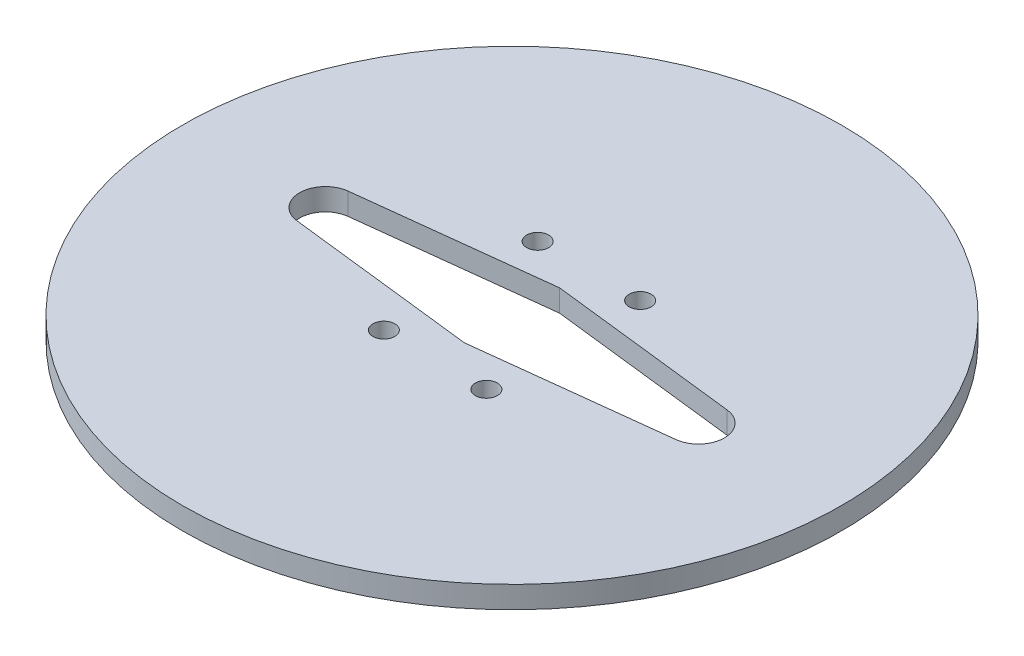
ISO-10303-21;
HEADER;
FILE_DESCRIPTION(('STEP AP214'),'2;1');
FILE_NAME('part.step','',(''),(''),'','','');
FILE_SCHEMA(('AUTOMOTIVE_DESIGN { 1 0 10303 214 1 1 1 1 }'));
ENDSEC;
DATA;
#1=APPLICATION_CONTEXT('core data for automotive mechanical design processes');
#2=APPLICATION_PROTOCOL_DEFINITION('international standard','automotive_design',2000,#1);
#3=PRODUCT_CONTEXT('',#1,'mechanical');
#4=PRODUCT('Part','Part','',(#3));
#5=PRODUCT_RELATED_PRODUCT_CATEGORY('part','',(#4));
#6=PRODUCT_DEFINITION_FORMATION('','',#4);
#7=PRODUCT_DEFINITION_CONTEXT('part definition',#1,'design');
#8=PRODUCT_DEFINITION('design','',#6,#7);
#9=PRODUCT_DEFINITION_SHAPE('','',#8);
#10=(LENGTH_UNIT() NAMED_UNIT(*) SI_UNIT(.MILLI.,.METRE.));
#11=(NAMED_UNIT(*) PLANE_ANGLE_UNIT() SI_UNIT($,.RADIAN.));
#12=(NAMED_UNIT(*) SI_UNIT($,.STERADIAN.) SOLID_ANGLE_UNIT());
#13=UNCERTAINTY_MEASURE_WITH_UNIT(LENGTH_MEASURE(1.E-05),#10,'distance_accuracy_value','');
#14=(GEOMETRIC_REPRESENTATION_CONTEXT(3) GLOBAL_UNCERTAINTY_ASSIGNED_CONTEXT((#13)) GLOBAL_UNIT_ASSIGNED_CONTEXT((#10,
#11,#12)) REPRESENTATION_CONTEXT('',''));
#15=CARTESIAN_POINT('',(0.,0.,0.));
#16=DIRECTION('',(0.,0.,1.));
#17=DIRECTION('',(1.,0.,0.));
#18=AXIS2_PLACEMENT_3D('',#15,#16,#17);
#19=CARTESIAN_POINT('',(0.,3.,0.));
#20=DIRECTION('',(0.,-1.,0.));
#21=DIRECTION('',(0.,0.,-1.));
#22=AXIS2_PLACEMENT_3D('',#19,#20,#21);
#23=CYLINDRICAL_SURFACE('',#22,45.);
#24=CARTESIAN_POINT('',(0.,3.,0.));
#25=DIRECTION('',(0.,1.,0.));
#26=DIRECTION('',(0.,0.,1.));
#27=AXIS2_PLACEMENT_3D('',#24,#25,#26);
#28=CIRCLE('',#27,45.);
#29=CARTESIAN_POINT('',(0.,3.,45.));
#30=VERTEX_POINT('',#29);
#31=EDGE_CURVE('E11',#30,#30,#28,.T.);
#32=ORIENTED_EDGE('',*,*,#31,.F.);
#33=EDGE_LOOP('',(#32));
#34=FACE_BOUND('',#33,.T.);
#35=CARTESIAN_POINT('',(0.,0.,0.));
#36=DIRECTION('',(0.,1.,0.));
#37=DIRECTION('',(0.,0.,1.));
#38=AXIS2_PLACEMENT_3D('',#35,#36,#37);
#39=CIRCLE('',#38,45.);
#40=CARTESIAN_POINT('',(0.,0.,45.));
#41=VERTEX_POINT('',#40);
#42=EDGE_CURVE('E47',#41,#41,#39,.T.);
#43=ORIENTED_EDGE('',*,*,#42,.T.);
#44=EDGE_LOOP('',(#43));
#45=FACE_BOUND('',#44,.T.);
#46=ADVANCED_FACE('F44',(#34,#45),#23,.T.);
#47=CARTESIAN_POINT('',(0.,3.,0.));
#48=DIRECTION('',(0.,1.,0.));
#49=DIRECTION('',(0.,0.,1.));
#50=AXIS2_PLACEMENT_3D('',#47,#48,#49);
#51=PLANE('',#50);
#52=CARTESIAN_POINT('',(7.,3.,10.5));
#53=DIRECTION('',(0.,1.,0.));
#54=DIRECTION('',(0.,0.,1.));
#55=AXIS2_PLACEMENT_3D('',#52,#53,#54);
#56=CIRCLE('',#55,1.5);
#57=CARTESIAN_POINT('',(7.,3.,12.));
#58=VERTEX_POINT('',#57);
#59=EDGE_CURVE('E310',#58,#58,#56,.T.);
#60=ORIENTED_EDGE('',*,*,#59,.F.);
#61=EDGE_LOOP('',(#60));
#62=FACE_BOUND('',#61,.T.);
#63=CARTESIAN_POINT('',(-7.,3.,-10.5));
#64=DIRECTION('',(0.,1.,0.));
#65=DIRECTION('',(0.,0.,1.));
#66=AXIS2_PLACEMENT_3D('',#63,#64,#65);
#67=CIRCLE('',#66,1.5);
#68=CARTESIAN_POINT('',(-7.,3.,-9.));
#69=VERTEX_POINT('',#68);
#70=EDGE_CURVE('E316',#69,#69,#67,.T.);
#71=ORIENTED_EDGE('',*,*,#70,.F.);
#72=EDGE_LOOP('',(#71));
#73=FACE_BOUND('',#72,.T.);
#74=CARTESIAN_POINT('',(7.,3.,-10.5));
#75=DIRECTION('',(0.,1.,0.));
#76=DIRECTION('',(0.,0.,1.));
#77=AXIS2_PLACEMENT_3D('',#74,#75,#76);
#78=CIRCLE('',#77,1.5);
#79=CARTESIAN_POINT('',(7.,3.,-9.));
#80=VERTEX_POINT('',#79);
#81=EDGE_CURVE('E328',#80,#80,#78,.T.);
#82=ORIENTED_EDGE('',*,*,#81,.F.);
#83=EDGE_LOOP('',(#82));
#84=FACE_BOUND('',#83,.T.);
#85=CARTESIAN_POINT('',(-7.,3.,10.5));
#86=DIRECTION('',(0.,1.,0.));
#87=DIRECTION('',(0.,0.,1.));
#88=AXIS2_PLACEMENT_3D('',#85,#86,#87);
#89=CIRCLE('',#88,1.5);
#90=CARTESIAN_POINT('',(-7.,3.,12.));
#91=VERTEX_POINT('',#90);
#92=EDGE_CURVE('E126',#91,#91,#89,.T.);
#93=ORIENTED_EDGE('',*,*,#92,.F.);
#94=EDGE_LOOP('',(#93));
#95=FACE_BOUND('',#94,.T.);
#96=CARTESIAN_POINT('',(-25.4765671512781,3.,0.));
#97=DIRECTION('',(0.,1.,0.));
#98=DIRECTION('',(0.,0.,1.));
#99=AXIS2_PLACEMENT_3D('',#96,#97,#98);
#100=CIRCLE('',#99,3.52343284872192);
#101=CARTESIAN_POINT('',(-25.8822505739769,3.,-3.49999999999999));
#102=VERTEX_POINT('',#101);
#103=CARTESIAN_POINT('',(-25.8822505739769,3.,3.5));
#104=VERTEX_POINT('',#103);
#105=EDGE_CURVE('E59',#102,#104,#100,.T.);
#106=ORIENTED_EDGE('',*,*,#105,.F.);
#107=DIRECTION('',(-0.993349426616597,0.,0.115138684378787));
#108=VECTOR('',#107,1.);
#109=CARTESIAN_POINT('',(-25.8822505739769,3.,-3.49999999999999));
#110=LINE('',#109,#108);
#111=CARTESIAN_POINT('',(0.,3.,-6.5));
#112=VERTEX_POINT('',#111);
#113=EDGE_CURVE('E119',#112,#102,#110,.T.);
#114=ORIENTED_EDGE('',*,*,#113,.F.);
#115=DIRECTION('',(-0.993349426616597,0.,-0.115138684378786));
#116=VECTOR('',#115,1.);
#117=CARTESIAN_POINT('',(0.,3.,-6.5));
#118=LINE('',#117,#116);
#119=CARTESIAN_POINT('',(25.8822505739769,3.,-3.50000000000001));
#120=VERTEX_POINT('',#119);
#121=EDGE_CURVE('E123',#120,#112,#118,.T.);
#122=ORIENTED_EDGE('',*,*,#121,.F.);
#123=CARTESIAN_POINT('',(25.4765671512781,3.,0.));
#124=DIRECTION('',(0.,1.,0.));
#125=DIRECTION('',(0.,0.,1.));
#126=AXIS2_PLACEMENT_3D('',#123,#124,#125);
#127=CIRCLE('',#126,3.52343284872192);
#128=CARTESIAN_POINT('',(25.8822505739769,3.,3.49999999999999));
#129=VERTEX_POINT('',#128);
#130=EDGE_CURVE('E150',#129,#120,#127,.T.);
#131=ORIENTED_EDGE('',*,*,#130,.F.);
#132=DIRECTION('',(0.993349426616597,0.,-0.115138684378787));
#133=VECTOR('',#132,1.);
#134=CARTESIAN_POINT('',(25.8822505739769,3.,3.49999999999999));
#135=LINE('',#134,#133);
#136=CARTESIAN_POINT('',(0.,3.,6.5));
#137=VERTEX_POINT('',#136);
#138=EDGE_CURVE('E146',#137,#129,#135,.T.);
#139=ORIENTED_EDGE('',*,*,#138,.F.);
#140=DIRECTION('',(0.993349426616597,0.,0.115138684378786));
#141=VECTOR('',#140,1.);
#142=CARTESIAN_POINT('',(0.,3.,6.5));
#143=LINE('',#142,#141);
#144=EDGE_CURVE('E142',#104,#137,#143,.T.);
#145=ORIENTED_EDGE('',*,*,#144,.F.);
#146=EDGE_LOOP('',(#106,#114,#122,#131,#139,#145));
#147=FACE_BOUND('',#146,.T.);
#148=ORIENTED_EDGE('',*,*,#31,.T.);
#149=EDGE_LOOP('',(#148));
#150=FACE_BOUND('',#149,.T.);
#151=ADVANCED_FACE('F174',(#62,#73,#84,#95,#147,#150),#51,.T.);
#152=CARTESIAN_POINT('',(0.,0.,0.));
#153=DIRECTION('',(0.,1.,0.));
#154=DIRECTION('',(0.,0.,1.));
#155=AXIS2_PLACEMENT_3D('',#152,#153,#154);
#156=PLANE('',#155);
#157=CARTESIAN_POINT('',(7.,0.,10.5));
#158=DIRECTION('',(0.,1.,0.));
#159=DIRECTION('',(0.,0.,1.));
#160=AXIS2_PLACEMENT_3D('',#157,#158,#159);
#161=CIRCLE('',#160,1.5);
#162=CARTESIAN_POINT('',(7.,0.,12.));
#163=VERTEX_POINT('',#162);
#164=EDGE_CURVE('E307',#163,#163,#161,.T.);
#165=ORIENTED_EDGE('',*,*,#164,.T.);
#166=EDGE_LOOP('',(#165));
#167=FACE_BOUND('',#166,.T.);
#168=CARTESIAN_POINT('',(-7.,0.,-10.5));
#169=DIRECTION('',(0.,1.,0.));
#170=DIRECTION('',(0.,0.,1.));
#171=AXIS2_PLACEMENT_3D('',#168,#169,#170);
#172=CIRCLE('',#171,1.5);
#173=CARTESIAN_POINT('',(-7.,0.,-9.));
#174=VERTEX_POINT('',#173);
#175=EDGE_CURVE('E325',#174,#174,#172,.T.);
#176=ORIENTED_EDGE('',*,*,#175,.T.);
#177=EDGE_LOOP('',(#176));
#178=FACE_BOUND('',#177,.T.);
#179=CARTESIAN_POINT('',(7.,0.,-10.5));
#180=DIRECTION('',(0.,1.,0.));
#181=DIRECTION('',(0.,0.,1.));
#182=AXIS2_PLACEMENT_3D('',#179,#180,#181);
#183=CIRCLE('',#182,1.5);
#184=CARTESIAN_POINT('',(7.,0.,-9.));
#185=VERTEX_POINT('',#184);
#186=EDGE_CURVE('E319',#185,#185,#183,.T.);
#187=ORIENTED_EDGE('',*,*,#186,.T.);
#188=EDGE_LOOP('',(#187));
#189=FACE_BOUND('',#188,.T.);
#190=CARTESIAN_POINT('',(-7.,0.,10.5));
#191=DIRECTION('',(0.,1.,0.));
#192=DIRECTION('',(0.,0.,1.));
#193=AXIS2_PLACEMENT_3D('',#190,#191,#192);
#194=CIRCLE('',#193,1.5);
#195=CARTESIAN_POINT('',(-7.,0.,12.));
#196=VERTEX_POINT('',#195);
#197=EDGE_CURVE('E143',#196,#196,#194,.T.);
#198=ORIENTED_EDGE('',*,*,#197,.T.);
#199=EDGE_LOOP('',(#198));
#200=FACE_BOUND('',#199,.T.);
#201=DIRECTION('',(-0.993349426616597,0.,0.115138684378787));
#202=VECTOR('',#201,1.);
#203=CARTESIAN_POINT('',(-25.8822505739769,0.,-3.49999999999999));
#204=LINE('',#203,#202);
#205=CARTESIAN_POINT('',(0.,0.,-6.5));
#206=VERTEX_POINT('',#205);
#207=CARTESIAN_POINT('',(-25.8822505739769,0.,-3.49999999999999));
#208=VERTEX_POINT('',#207);
#209=EDGE_CURVE('E106',#206,#208,#204,.T.);
#210=ORIENTED_EDGE('',*,*,#209,.T.);
#211=CARTESIAN_POINT('',(-25.4765671512781,0.,0.));
#212=DIRECTION('',(0.,1.,0.));
#213=DIRECTION('',(0.,0.,1.));
#214=AXIS2_PLACEMENT_3D('',#211,#212,#213);
#215=CIRCLE('',#214,3.52343284872192);
#216=CARTESIAN_POINT('',(-25.8822505739769,0.,3.50000000000001));
#217=VERTEX_POINT('',#216);
#218=EDGE_CURVE('E99',#208,#217,#215,.T.);
#219=ORIENTED_EDGE('',*,*,#218,.T.);
#220=DIRECTION('',(0.993349426616597,0.,0.115138684378786));
#221=VECTOR('',#220,1.);
#222=CARTESIAN_POINT('',(0.,0.,6.5));
#223=LINE('',#222,#221);
#224=CARTESIAN_POINT('',(0.,0.,6.5));
#225=VERTEX_POINT('',#224);
#226=EDGE_CURVE('E109',#217,#225,#223,.T.);
#227=ORIENTED_EDGE('',*,*,#226,.T.);
#228=DIRECTION('',(0.993349426616597,0.,-0.115138684378787));
#229=VECTOR('',#228,1.);
#230=CARTESIAN_POINT('',(25.8822505739769,0.,3.49999999999999));
#231=LINE('',#230,#229);
#232=CARTESIAN_POINT('',(25.8822505739769,0.,3.49999999999999));
#233=VERTEX_POINT('',#232);
#234=EDGE_CURVE('E67',#225,#233,#231,.T.);
#235=ORIENTED_EDGE('',*,*,#234,.T.);
#236=CARTESIAN_POINT('',(25.4765671512781,0.,0.));
#237=DIRECTION('',(0.,1.,0.));
#238=DIRECTION('',(0.,0.,1.));
#239=AXIS2_PLACEMENT_3D('',#236,#237,#238);
#240=CIRCLE('',#239,3.52343284872192);
#241=CARTESIAN_POINT('',(25.8822505739769,0.,-3.50000000000001));
#242=VERTEX_POINT('',#241);
#243=EDGE_CURVE('E131',#233,#242,#240,.T.);
#244=ORIENTED_EDGE('',*,*,#243,.T.);
#245=DIRECTION('',(-0.993349426616597,0.,-0.115138684378786));
#246=VECTOR('',#245,1.);
#247=CARTESIAN_POINT('',(0.,0.,-6.5));
#248=LINE('',#247,#246);
#249=EDGE_CURVE('E135',#242,#206,#248,.T.);
#250=ORIENTED_EDGE('',*,*,#249,.T.);
#251=EDGE_LOOP('',(#210,#219,#227,#235,#244,#250));
#252=FACE_BOUND('',#251,.T.);
#253=ORIENTED_EDGE('',*,*,#42,.F.);
#254=EDGE_LOOP('',(#253));
#255=FACE_BOUND('',#254,.T.);
#256=ADVANCED_FACE('F114',(#167,#178,#189,#200,#252,#255),#156,.F.);
#257=CARTESIAN_POINT('',(-25.4765671512781,0.,0.));
#258=DIRECTION('',(0.,1.,0.));
#259=DIRECTION('',(0.,0.,1.));
#260=AXIS2_PLACEMENT_3D('',#257,#258,#259);
#261=CYLINDRICAL_SURFACE('',#260,3.52343284872192);
#262=ORIENTED_EDGE('',*,*,#105,.T.);
#263=DIRECTION('',(0.,1.,0.));
#264=VECTOR('',#263,1.);
#265=CARTESIAN_POINT('',(-25.8822505739769,0.,3.50000000000001));
#266=LINE('',#265,#264);
#267=EDGE_CURVE('E95',#217,#104,#266,.T.);
#268=ORIENTED_EDGE('',*,*,#267,.F.);
#269=ORIENTED_EDGE('',*,*,#218,.F.);
#270=DIRECTION('',(0.,1.,0.));
#271=VECTOR('',#270,1.);
#272=CARTESIAN_POINT('',(-25.8822505739769,0.,-3.49999999999999));
#273=LINE('',#272,#271);
#274=EDGE_CURVE('E157',#208,#102,#273,.T.);
#275=ORIENTED_EDGE('',*,*,#274,.T.);
#276=EDGE_LOOP('',(#262,#268,#269,#275));
#277=FACE_BOUND('',#276,.T.);
#278=ADVANCED_FACE('F97',(#277),#261,.F.);
#279=CARTESIAN_POINT('',(-25.8822505739769,0.,-3.49999999999999));
#280=DIRECTION('',(-0.115138684378787,0.,-0.993349426616597));
#281=DIRECTION('',(-0.993349426616597,0.,0.115138684378787));
#282=AXIS2_PLACEMENT_3D('',#279,#280,#281);
#283=PLANE('',#282);
#284=ORIENTED_EDGE('',*,*,#113,.T.);
#285=ORIENTED_EDGE('',*,*,#274,.F.);
#286=ORIENTED_EDGE('',*,*,#209,.F.);
#287=DIRECTION('',(0.,1.,0.));
#288=VECTOR('',#287,1.);
#289=CARTESIAN_POINT('',(0.,0.,-6.5));
#290=LINE('',#289,#288);
#291=EDGE_CURVE('E160',#206,#112,#290,.T.);
#292=ORIENTED_EDGE('',*,*,#291,.T.);
#293=EDGE_LOOP('',(#284,#285,#286,#292));
#294=FACE_BOUND('',#293,.T.);
#295=ADVANCED_FACE('F185',(#294),#283,.F.);
#296=CARTESIAN_POINT('',(0.,0.,-6.5));
#297=DIRECTION('',(0.115138684378786,0.,-0.993349426616597));
#298=DIRECTION('',(-0.993349426616597,0.,-0.115138684378786));
#299=AXIS2_PLACEMENT_3D('',#296,#297,#298);
#300=PLANE('',#299);
#301=ORIENTED_EDGE('',*,*,#121,.T.);
#302=ORIENTED_EDGE('',*,*,#291,.F.);
#303=ORIENTED_EDGE('',*,*,#249,.F.);
#304=DIRECTION('',(0.,1.,0.));
#305=VECTOR('',#304,1.);
#306=CARTESIAN_POINT('',(25.8822505739769,0.,-3.50000000000001));
#307=LINE('',#306,#305);
#308=EDGE_CURVE('E163',#242,#120,#307,.T.);
#309=ORIENTED_EDGE('',*,*,#308,.T.);
#310=EDGE_LOOP('',(#301,#302,#303,#309));
#311=FACE_BOUND('',#310,.T.);
#312=ADVANCED_FACE('F183',(#311),#300,.F.);
#313=CARTESIAN_POINT('',(25.4765671512781,0.,0.));
#314=DIRECTION('',(0.,1.,0.));
#315=DIRECTION('',(0.,0.,1.));
#316=AXIS2_PLACEMENT_3D('',#313,#314,#315);
#317=CYLINDRICAL_SURFACE('',#316,3.52343284872192);
#318=ORIENTED_EDGE('',*,*,#130,.T.);
#319=ORIENTED_EDGE('',*,*,#308,.F.);
#320=ORIENTED_EDGE('',*,*,#243,.F.);
#321=DIRECTION('',(0.,1.,0.));
#322=VECTOR('',#321,1.);
#323=CARTESIAN_POINT('',(25.8822505739769,0.,3.49999999999999));
#324=LINE('',#323,#322);
#325=EDGE_CURVE('E166',#233,#129,#324,.T.);
#326=ORIENTED_EDGE('',*,*,#325,.T.);
#327=EDGE_LOOP('',(#318,#319,#320,#326));
#328=FACE_BOUND('',#327,.T.);
#329=ADVANCED_FACE('F179',(#328),#317,.F.);
#330=CARTESIAN_POINT('',(25.8822505739769,0.,3.49999999999999));
#331=DIRECTION('',(0.115138684378787,0.,0.993349426616597));
#332=DIRECTION('',(0.993349426616597,0.,-0.115138684378787));
#333=AXIS2_PLACEMENT_3D('',#330,#331,#332);
#334=PLANE('',#333);
#335=ORIENTED_EDGE('',*,*,#138,.T.);
#336=ORIENTED_EDGE('',*,*,#325,.F.);
#337=ORIENTED_EDGE('',*,*,#234,.F.);
#338=DIRECTION('',(0.,1.,0.));
#339=VECTOR('',#338,1.);
#340=CARTESIAN_POINT('',(0.,0.,6.5));
#341=LINE('',#340,#339);
#342=EDGE_CURVE('E105',#225,#137,#341,.T.);
#343=ORIENTED_EDGE('',*,*,#342,.T.);
#344=EDGE_LOOP('',(#335,#336,#337,#343));
#345=FACE_BOUND('',#344,.T.);
#346=ADVANCED_FACE('F170',(#345),#334,.F.);
#347=CARTESIAN_POINT('',(0.,0.,6.5));
#348=DIRECTION('',(-0.115138684378786,0.,0.993349426616597));
#349=DIRECTION('',(0.993349426616597,0.,0.115138684378786));
#350=AXIS2_PLACEMENT_3D('',#347,#348,#349);
#351=PLANE('',#350);
#352=ORIENTED_EDGE('',*,*,#144,.T.);
#353=ORIENTED_EDGE('',*,*,#342,.F.);
#354=ORIENTED_EDGE('',*,*,#226,.F.);
#355=ORIENTED_EDGE('',*,*,#267,.T.);
#356=EDGE_LOOP('',(#352,#353,#354,#355));
#357=FACE_BOUND('',#356,.T.);
#358=ADVANCED_FACE('F110',(#357),#351,.F.);
#359=CARTESIAN_POINT('',(-7.,0.,10.5));
#360=DIRECTION('',(0.,1.,0.));
#361=DIRECTION('',(0.,0.,1.));
#362=AXIS2_PLACEMENT_3D('',#359,#360,#361);
#363=CYLINDRICAL_SURFACE('',#362,1.5);
#364=ORIENTED_EDGE('',*,*,#197,.F.);
#365=EDGE_LOOP('',(#364));
#366=FACE_BOUND('',#365,.T.);
#367=ORIENTED_EDGE('',*,*,#92,.T.);
#368=EDGE_LOOP('',(#367));
#369=FACE_BOUND('',#368,.T.);
#370=ADVANCED_FACE('F217',(#366,#369),#363,.F.);
#371=CARTESIAN_POINT('',(7.,0.,-10.5));
#372=DIRECTION('',(0.,1.,0.));
#373=DIRECTION('',(0.,0.,1.));
#374=AXIS2_PLACEMENT_3D('',#371,#372,#373);
#375=CYLINDRICAL_SURFACE('',#374,1.5);
#376=ORIENTED_EDGE('',*,*,#186,.F.);
#377=EDGE_LOOP('',(#376));
#378=FACE_BOUND('',#377,.T.);
#379=ORIENTED_EDGE('',*,*,#81,.T.);
#380=EDGE_LOOP('',(#379));
#381=FACE_BOUND('',#380,.T.);
#382=ADVANCED_FACE('F272',(#378,#381),#375,.F.);
#383=CARTESIAN_POINT('',(-7.,0.,-10.5));
#384=DIRECTION('',(0.,1.,0.));
#385=DIRECTION('',(0.,0.,1.));
#386=AXIS2_PLACEMENT_3D('',#383,#384,#385);
#387=CYLINDRICAL_SURFACE('',#386,1.5);
#388=ORIENTED_EDGE('',*,*,#175,.F.);
#389=EDGE_LOOP('',(#388));
#390=FACE_BOUND('',#389,.T.);
#391=ORIENTED_EDGE('',*,*,#70,.T.);
#392=EDGE_LOOP('',(#391));
#393=FACE_BOUND('',#392,.T.);
#394=ADVANCED_FACE('F280',(#390,#393),#387,.F.);
#395=CARTESIAN_POINT('',(7.,0.,10.5));
#396=DIRECTION('',(0.,1.,0.));
#397=DIRECTION('',(0.,0.,1.));
#398=AXIS2_PLACEMENT_3D('',#395,#396,#397);
#399=CYLINDRICAL_SURFACE('',#398,1.5);
#400=ORIENTED_EDGE('',*,*,#164,.F.);
#401=EDGE_LOOP('',(#400));
#402=FACE_BOUND('',#401,.T.);
#403=ORIENTED_EDGE('',*,*,#59,.T.);
#404=EDGE_LOOP('',(#403));
#405=FACE_BOUND('',#404,.T.);
#406=ADVANCED_FACE('F289',(#402,#405),#399,.F.);
#407=CLOSED_SHELL('',(#46,#151,#256,#278,#295,#312,#329,#346,#358,#370,#382,#394,#406));
#408=MANIFOLD_SOLID_BREP('B2',#407);
#409=ADVANCED_BREP_SHAPE_REPRESENTATION('',(#18,#408),#14);
#410=SHAPE_DEFINITION_REPRESENTATION(#9,#409);
ENDSEC;
END-ISO-10303-21;
